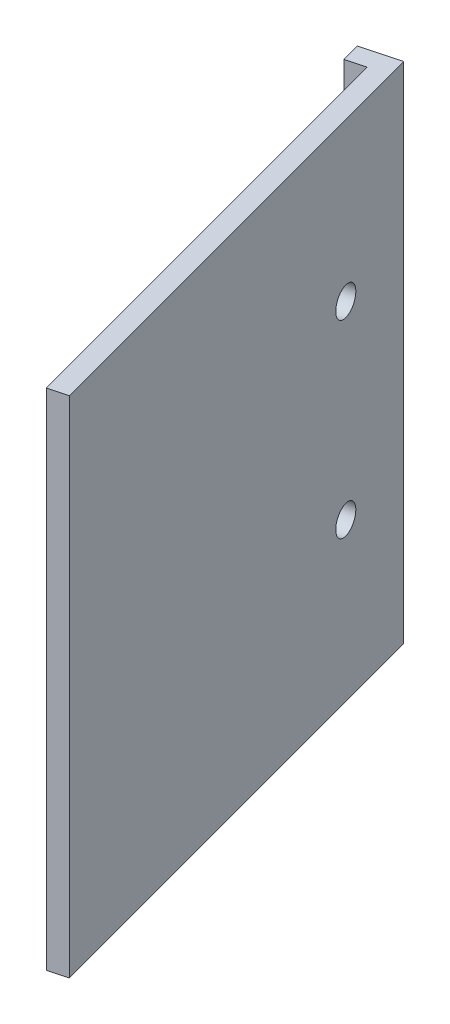
ISO-10303-21;
HEADER;
FILE_DESCRIPTION(('STEP AP214'),'2;1');
FILE_NAME('part.step','',(''),(''),'','','');
FILE_SCHEMA(('AUTOMOTIVE_DESIGN { 1 0 10303 214 1 1 1 1 }'));
ENDSEC;
DATA;
#1=APPLICATION_CONTEXT('core data for automotive mechanical design processes');
#2=APPLICATION_PROTOCOL_DEFINITION('international standard','automotive_design',2000,#1);
#3=PRODUCT_CONTEXT('',#1,'mechanical');
#4=PRODUCT('Part','Part','',(#3));
#5=PRODUCT_RELATED_PRODUCT_CATEGORY('part','',(#4));
#6=PRODUCT_DEFINITION_FORMATION('','',#4);
#7=PRODUCT_DEFINITION_CONTEXT('part definition',#1,'design');
#8=PRODUCT_DEFINITION('design','',#6,#7);
#9=PRODUCT_DEFINITION_SHAPE('','',#8);
#10=(LENGTH_UNIT() NAMED_UNIT(*) SI_UNIT(.MILLI.,.METRE.));
#11=(NAMED_UNIT(*) PLANE_ANGLE_UNIT() SI_UNIT($,.RADIAN.));
#12=(NAMED_UNIT(*) SI_UNIT($,.STERADIAN.) SOLID_ANGLE_UNIT());
#13=UNCERTAINTY_MEASURE_WITH_UNIT(LENGTH_MEASURE(1.E-05),#10,'distance_accuracy_value','');
#14=(GEOMETRIC_REPRESENTATION_CONTEXT(3) GLOBAL_UNCERTAINTY_ASSIGNED_CONTEXT((#13)) GLOBAL_UNIT_ASSIGNED_CONTEXT((#10,
#11,#12)) REPRESENTATION_CONTEXT('',''));
#15=CARTESIAN_POINT('',(0.,0.,0.));
#16=DIRECTION('',(0.,0.,1.));
#17=DIRECTION('',(1.,0.,0.));
#18=AXIS2_PLACEMENT_3D('',#15,#16,#17);
#19=CARTESIAN_POINT('',(937.24206980545,-580.,2292.302325397));
#20=DIRECTION('',(0.965925826288944,0.,-0.258819045102985));
#21=DIRECTION('',(0.,1.,0.));
#22=AXIS2_PLACEMENT_3D('',#19,#20,#21);
#23=CYLINDRICAL_SURFACE('',#22,4.5);
#24=CARTESIAN_POINT('',(937.14547722282,-580.,2292.328207301));
#25=DIRECTION('',(0.965925826288944,0.,-0.258819045102985));
#26=DIRECTION('',(0.,1.,0.));
#27=AXIS2_PLACEMENT_3D('',#24,#25,#26);
#28=CIRCLE('',#27,4.5);
#29=CARTESIAN_POINT('',(937.14547722282,-575.5,2292.328207301));
#30=VERTEX_POINT('',#29);
#31=EDGE_CURVE('E146',#30,#30,#28,.T.);
#32=ORIENTED_EDGE('',*,*,#31,.T.);
#33=DIRECTION('',(-0.965925826288944,0.,0.258819045102985));
#34=VECTOR('',#33,1.);
#35=CARTESIAN_POINT('',(937.24206980545,-575.5,2292.302325397));
#36=LINE('',#35,#34);
#37=CARTESIAN_POINT('',(931.34992226509,-575.5,2293.881121572));
#38=VERTEX_POINT('',#37);
#39=EDGE_CURVE('E11',#30,#38,#36,.T.);
#40=ORIENTED_EDGE('',*,*,#39,.T.);
#41=CARTESIAN_POINT('',(931.34992226509,-580.,2293.881121572));
#42=DIRECTION('',(0.965925826288944,0.,-0.258819045102985));
#43=DIRECTION('',(0.,1.,0.));
#44=AXIS2_PLACEMENT_3D('',#41,#42,#43);
#45=CIRCLE('',#44,4.5);
#46=EDGE_CURVE('E122',#38,#38,#45,.T.);
#47=ORIENTED_EDGE('',*,*,#46,.F.);
#48=ORIENTED_EDGE('',*,*,#39,.F.);
#49=EDGE_LOOP('',(#32,#40,#47,#48));
#50=FACE_BOUND('',#49,.T.);
#51=ADVANCED_FACE('F17',(#50),#23,.F.);
#52=CARTESIAN_POINT('',(937.24206980545,-640.,2292.302325397));
#53=DIRECTION('',(0.965925826288944,0.,-0.258819045102985));
#54=DIRECTION('',(0.,1.,0.));
#55=AXIS2_PLACEMENT_3D('',#52,#53,#54);
#56=CYLINDRICAL_SURFACE('',#55,4.5);
#57=CARTESIAN_POINT('',(937.14547722282,-640.,2292.328207301));
#58=DIRECTION('',(0.965925826288944,0.,-0.258819045102985));
#59=DIRECTION('',(0.,1.,0.));
#60=AXIS2_PLACEMENT_3D('',#57,#58,#59);
#61=CIRCLE('',#60,4.5);
#62=CARTESIAN_POINT('',(937.14547722282,-635.5,2292.328207301));
#63=VERTEX_POINT('',#62);
#64=EDGE_CURVE('E116',#63,#63,#61,.T.);
#65=ORIENTED_EDGE('',*,*,#64,.T.);
#66=DIRECTION('',(-0.965925826288944,0.,0.258819045102985));
#67=VECTOR('',#66,1.);
#68=CARTESIAN_POINT('',(937.24206980545,-635.5,2292.302325397));
#69=LINE('',#68,#67);
#70=CARTESIAN_POINT('',(931.34992226509,-635.5,2293.881121572));
#71=VERTEX_POINT('',#70);
#72=EDGE_CURVE('E26',#63,#71,#69,.T.);
#73=ORIENTED_EDGE('',*,*,#72,.T.);
#74=CARTESIAN_POINT('',(931.34992226509,-640.,2293.881121572));
#75=DIRECTION('',(0.965925826288944,0.,-0.258819045102985));
#76=DIRECTION('',(0.,1.,0.));
#77=AXIS2_PLACEMENT_3D('',#74,#75,#76);
#78=CIRCLE('',#77,4.5);
#79=EDGE_CURVE('E118',#71,#71,#78,.T.);
#80=ORIENTED_EDGE('',*,*,#79,.F.);
#81=ORIENTED_EDGE('',*,*,#72,.F.);
#82=EDGE_LOOP('',(#65,#73,#80,#81));
#83=FACE_BOUND('',#82,.T.);
#84=ADVANCED_FACE('F114',(#83),#56,.F.);
#85=CARTESIAN_POINT('',(930.41618205016,-530.,2267.214135818));
#86=DIRECTION('',(0.,1.,0.));
#87=DIRECTION('',(1.,0.,0.));
#88=AXIS2_PLACEMENT_3D('',#85,#86,#87);
#89=PLANE('',#88);
#90=DIRECTION('',(0.258819045102985,0.,0.965925826288944));
#91=VECTOR('',#90,1.);
#92=CARTESIAN_POINT('',(930.41618205016,-530.,2267.214135818));
#93=LINE('',#92,#91);
#94=CARTESIAN_POINT('',(930.41618205016,-530.,2267.214135818));
#95=VERTEX_POINT('',#94);
#96=CARTESIAN_POINT('',(969.23903881554,-530.,2412.103009761));
#97=VERTEX_POINT('',#96);
#98=EDGE_CURVE('E152',#95,#97,#93,.T.);
#99=ORIENTED_EDGE('',*,*,#98,.F.);
#100=DIRECTION('',(0.965925826288944,0.,-0.258819045102985));
#101=VECTOR('',#100,1.);
#102=CARTESIAN_POINT('',(918.82507213469,-530.,2270.319964359));
#103=LINE('',#102,#101);
#104=CARTESIAN_POINT('',(918.82507213469,-530.,2270.319964359));
#105=VERTEX_POINT('',#104);
#106=EDGE_CURVE('E151',#105,#95,#103,.T.);
#107=ORIENTED_EDGE('',*,*,#106,.F.);
#108=DIRECTION('',(0.258819045102985,0.,0.965925826288944));
#109=VECTOR('',#108,1.);
#110=CARTESIAN_POINT('',(918.82507213469,-530.,2270.319964359));
#111=LINE('',#110,#109);
#112=CARTESIAN_POINT('',(920.37798640531,-530.,2276.115519317));
#113=VERTEX_POINT('',#112);
#114=EDGE_CURVE('E70',#105,#113,#111,.T.);
#115=ORIENTED_EDGE('',*,*,#114,.T.);
#116=DIRECTION('',(-0.965925826288944,0.,0.258819045102985));
#117=VECTOR('',#116,1.);
#118=CARTESIAN_POINT('',(926.17354136304,-530.,2274.562605046));
#119=LINE('',#118,#117);
#120=CARTESIAN_POINT('',(926.17354136304,-530.,2274.562605046));
#121=VERTEX_POINT('',#120);
#122=EDGE_CURVE('E56',#121,#113,#119,.T.);
#123=ORIENTED_EDGE('',*,*,#122,.F.);
#124=DIRECTION('',(0.258819045102985,0.,0.965925826288944));
#125=VECTOR('',#124,1.);
#126=CARTESIAN_POINT('',(924.62062709243,-530.,2268.767050088));
#127=LINE('',#126,#125);
#128=CARTESIAN_POINT('',(963.4434838578,-530.,2413.655924032));
#129=VERTEX_POINT('',#128);
#130=EDGE_CURVE('E129',#121,#129,#127,.T.);
#131=ORIENTED_EDGE('',*,*,#130,.T.);
#132=DIRECTION('',(-0.965925826288944,0.,0.258819045102985));
#133=VECTOR('',#132,1.);
#134=CARTESIAN_POINT('',(969.23903881554,-530.,2412.103009761));
#135=LINE('',#134,#133);
#136=EDGE_CURVE('E107',#97,#129,#135,.T.);
#137=ORIENTED_EDGE('',*,*,#136,.F.);
#138=EDGE_LOOP('',(#99,#107,#115,#123,#131,#137));
#139=FACE_BOUND('',#138,.T.);
#140=ADVANCED_FACE('F211',(#139),#89,.T.);
#141=CARTESIAN_POINT('',(969.23903881554,-690.,2412.103009761));
#142=DIRECTION('',(0.258819045102985,0.,0.965925826288944));
#143=DIRECTION('',(0.,-1.,0.));
#144=AXIS2_PLACEMENT_3D('',#141,#142,#143);
#145=PLANE('',#144);
#146=DIRECTION('',(-0.965925826288944,0.,0.258819045102985));
#147=VECTOR('',#146,1.);
#148=CARTESIAN_POINT('',(969.23903881554,-690.,2412.103009761));
#149=LINE('',#148,#147);
#150=CARTESIAN_POINT('',(969.23903881554,-690.,2412.103009761));
#151=VERTEX_POINT('',#150);
#152=CARTESIAN_POINT('',(963.4434838578,-690.,2413.655924032));
#153=VERTEX_POINT('',#152);
#154=EDGE_CURVE('E189',#151,#153,#149,.T.);
#155=ORIENTED_EDGE('',*,*,#154,.F.);
#156=DIRECTION('',(0.,1.,0.));
#157=VECTOR('',#156,1.);
#158=CARTESIAN_POINT('',(969.23903881554,-690.,2412.103009761));
#159=LINE('',#158,#157);
#160=EDGE_CURVE('E143',#151,#97,#159,.T.);
#161=ORIENTED_EDGE('',*,*,#160,.T.);
#162=ORIENTED_EDGE('',*,*,#136,.T.);
#163=DIRECTION('',(0.,1.,0.));
#164=VECTOR('',#163,1.);
#165=CARTESIAN_POINT('',(963.4434838578,-690.,2413.655924032));
#166=LINE('',#165,#164);
#167=EDGE_CURVE('E132',#153,#129,#166,.T.);
#168=ORIENTED_EDGE('',*,*,#167,.F.);
#169=EDGE_LOOP('',(#155,#161,#162,#168));
#170=FACE_BOUND('',#169,.T.);
#171=ADVANCED_FACE('F199',(#170),#145,.T.);
#172=CARTESIAN_POINT('',(924.62062709243,-690.,2268.767050088));
#173=DIRECTION('',(-0.965925826288944,0.,0.258819045102985));
#174=DIRECTION('',(0.,1.,0.));
#175=AXIS2_PLACEMENT_3D('',#172,#173,#174);
#176=PLANE('',#175);
#177=ORIENTED_EDGE('',*,*,#46,.T.);
#178=EDGE_LOOP('',(#177));
#179=FACE_BOUND('',#178,.T.);
#180=ORIENTED_EDGE('',*,*,#79,.T.);
#181=EDGE_LOOP('',(#180));
#182=FACE_BOUND('',#181,.T.);
#183=DIRECTION('',(0.,1.,0.));
#184=VECTOR('',#183,1.);
#185=CARTESIAN_POINT('',(926.17354136304,-690.,2274.562605046));
#186=LINE('',#185,#184);
#187=CARTESIAN_POINT('',(926.17354136304,-690.,2274.562605046));
#188=VERTEX_POINT('',#187);
#189=EDGE_CURVE('E138',#188,#121,#186,.T.);
#190=ORIENTED_EDGE('',*,*,#189,.F.);
#191=DIRECTION('',(0.258819045102985,0.,0.965925826288944));
#192=VECTOR('',#191,1.);
#193=CARTESIAN_POINT('',(924.62062709243,-690.,2268.767050088));
#194=LINE('',#193,#192);
#195=EDGE_CURVE('E181',#188,#153,#194,.T.);
#196=ORIENTED_EDGE('',*,*,#195,.T.);
#197=ORIENTED_EDGE('',*,*,#167,.T.);
#198=ORIENTED_EDGE('',*,*,#130,.F.);
#199=EDGE_LOOP('',(#190,#196,#197,#198));
#200=FACE_BOUND('',#199,.T.);
#201=ADVANCED_FACE('F201',(#179,#182,#200),#176,.T.);
#202=CARTESIAN_POINT('',(926.17354136304,-690.,2274.562605046));
#203=DIRECTION('',(0.258819045102985,0.,0.965925826288944));
#204=DIRECTION('',(0.,-1.,0.));
#205=AXIS2_PLACEMENT_3D('',#202,#203,#204);
#206=PLANE('',#205);
#207=DIRECTION('',(-0.965925826288944,0.,0.258819045102985));
#208=VECTOR('',#207,1.);
#209=CARTESIAN_POINT('',(926.17354136304,-690.,2274.562605046));
#210=LINE('',#209,#208);
#211=CARTESIAN_POINT('',(920.37798640531,-690.,2276.115519317));
#212=VERTEX_POINT('',#211);
#213=EDGE_CURVE('E172',#188,#212,#210,.T.);
#214=ORIENTED_EDGE('',*,*,#213,.F.);
#215=ORIENTED_EDGE('',*,*,#189,.T.);
#216=ORIENTED_EDGE('',*,*,#122,.T.);
#217=DIRECTION('',(0.,1.,0.));
#218=VECTOR('',#217,1.);
#219=CARTESIAN_POINT('',(920.37798640531,-690.,2276.115519317));
#220=LINE('',#219,#218);
#221=EDGE_CURVE('E173',#212,#113,#220,.T.);
#222=ORIENTED_EDGE('',*,*,#221,.F.);
#223=EDGE_LOOP('',(#214,#215,#216,#222));
#224=FACE_BOUND('',#223,.T.);
#225=ADVANCED_FACE('F203',(#224),#206,.T.);
#226=CARTESIAN_POINT('',(918.82507213469,-690.,2270.319964359));
#227=DIRECTION('',(-0.965925826288944,0.,0.258819045102985));
#228=DIRECTION('',(0.,1.,0.));
#229=AXIS2_PLACEMENT_3D('',#226,#227,#228);
#230=PLANE('',#229);
#231=DIRECTION('',(0.,1.,0.));
#232=VECTOR('',#231,1.);
#233=CARTESIAN_POINT('',(918.82507213469,-690.,2270.319964359));
#234=LINE('',#233,#232);
#235=CARTESIAN_POINT('',(918.82507213469,-690.,2270.319964359));
#236=VERTEX_POINT('',#235);
#237=EDGE_CURVE('E147',#236,#105,#234,.T.);
#238=ORIENTED_EDGE('',*,*,#237,.F.);
#239=DIRECTION('',(0.258819045102985,0.,0.965925826288944));
#240=VECTOR('',#239,1.);
#241=CARTESIAN_POINT('',(918.82507213469,-690.,2270.319964359));
#242=LINE('',#241,#240);
#243=EDGE_CURVE('E168',#236,#212,#242,.T.);
#244=ORIENTED_EDGE('',*,*,#243,.T.);
#245=ORIENTED_EDGE('',*,*,#221,.T.);
#246=ORIENTED_EDGE('',*,*,#114,.F.);
#247=EDGE_LOOP('',(#238,#244,#245,#246));
#248=FACE_BOUND('',#247,.T.);
#249=ADVANCED_FACE('F206',(#248),#230,.T.);
#250=CARTESIAN_POINT('',(930.41618205016,-690.,2267.214135818));
#251=DIRECTION('',(0.258819045102985,0.,0.965925826288944));
#252=DIRECTION('',(0.,-1.,0.));
#253=AXIS2_PLACEMENT_3D('',#250,#251,#252);
#254=PLANE('',#253);
#255=DIRECTION('',(0.965925826288944,0.,-0.258819045102985));
#256=VECTOR('',#255,1.);
#257=CARTESIAN_POINT('',(918.82507213469,-690.,2270.319964359));
#258=LINE('',#257,#256);
#259=CARTESIAN_POINT('',(930.41618205016,-690.,2267.214135818));
#260=VERTEX_POINT('',#259);
#261=EDGE_CURVE('E160',#236,#260,#258,.T.);
#262=ORIENTED_EDGE('',*,*,#261,.F.);
#263=ORIENTED_EDGE('',*,*,#237,.T.);
#264=ORIENTED_EDGE('',*,*,#106,.T.);
#265=DIRECTION('',(0.,1.,0.));
#266=VECTOR('',#265,1.);
#267=CARTESIAN_POINT('',(930.41618205016,-690.,2267.214135818));
#268=LINE('',#267,#266);
#269=EDGE_CURVE('E139',#260,#95,#268,.T.);
#270=ORIENTED_EDGE('',*,*,#269,.F.);
#271=EDGE_LOOP('',(#262,#263,#264,#270));
#272=FACE_BOUND('',#271,.T.);
#273=ADVANCED_FACE('F208',(#272),#254,.F.);
#274=CARTESIAN_POINT('',(930.41618205016,-690.,2267.214135818));
#275=DIRECTION('',(-0.965925826288944,0.,0.258819045102985));
#276=DIRECTION('',(0.,1.,0.));
#277=AXIS2_PLACEMENT_3D('',#274,#275,#276);
#278=PLANE('',#277);
#279=ORIENTED_EDGE('',*,*,#31,.F.);
#280=EDGE_LOOP('',(#279));
#281=FACE_BOUND('',#280,.T.);
#282=ORIENTED_EDGE('',*,*,#64,.F.);
#283=EDGE_LOOP('',(#282));
#284=FACE_BOUND('',#283,.T.);
#285=ORIENTED_EDGE('',*,*,#98,.T.);
#286=ORIENTED_EDGE('',*,*,#160,.F.);
#287=DIRECTION('',(0.258819045102985,0.,0.965925826288944));
#288=VECTOR('',#287,1.);
#289=CARTESIAN_POINT('',(930.41618205016,-690.,2267.214135818));
#290=LINE('',#289,#288);
#291=EDGE_CURVE('E156',#260,#151,#290,.T.);
#292=ORIENTED_EDGE('',*,*,#291,.F.);
#293=ORIENTED_EDGE('',*,*,#269,.T.);
#294=EDGE_LOOP('',(#285,#286,#292,#293));
#295=FACE_BOUND('',#294,.T.);
#296=ADVANCED_FACE('F210',(#281,#284,#295),#278,.F.);
#297=CARTESIAN_POINT('',(930.41618205016,-690.,2267.214135818));
#298=DIRECTION('',(0.,1.,0.));
#299=DIRECTION('',(1.,0.,0.));
#300=AXIS2_PLACEMENT_3D('',#297,#298,#299);
#301=PLANE('',#300);
#302=ORIENTED_EDGE('',*,*,#154,.T.);
#303=ORIENTED_EDGE('',*,*,#195,.F.);
#304=ORIENTED_EDGE('',*,*,#213,.T.);
#305=ORIENTED_EDGE('',*,*,#243,.F.);
#306=ORIENTED_EDGE('',*,*,#261,.T.);
#307=ORIENTED_EDGE('',*,*,#291,.T.);
#308=EDGE_LOOP('',(#302,#303,#304,#305,#306,#307));
#309=FACE_BOUND('',#308,.T.);
#310=ADVANCED_FACE('F196',(#309),#301,.F.);
#311=CLOSED_SHELL('',(#51,#84,#140,#171,#201,#225,#249,#273,#296,#310));
#312=MANIFOLD_SOLID_BREP('B1',#311);
#313=ADVANCED_BREP_SHAPE_REPRESENTATION('',(#18,#312),#14);
#314=SHAPE_DEFINITION_REPRESENTATION(#9,#313);
ENDSEC;
END-ISO-10303-21;
